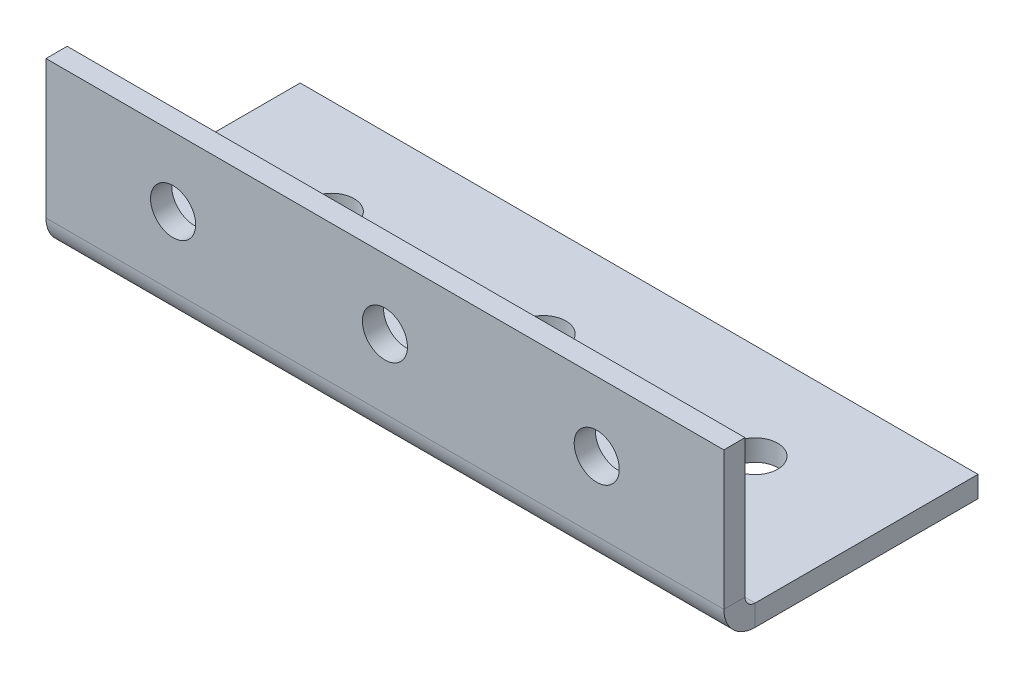
ISO-10303-21;
HEADER;
FILE_DESCRIPTION(('STEP AP214'),'2;1');
FILE_NAME('part.step','',(''),(''),'','','');
FILE_SCHEMA(('AUTOMOTIVE_DESIGN { 1 0 10303 214 1 1 1 1 }'));
ENDSEC;
DATA;
#1=APPLICATION_CONTEXT('core data for automotive mechanical design processes');
#2=APPLICATION_PROTOCOL_DEFINITION('international standard','automotive_design',2000,#1);
#3=PRODUCT_CONTEXT('',#1,'mechanical');
#4=PRODUCT('Part','Part','',(#3));
#5=PRODUCT_RELATED_PRODUCT_CATEGORY('part','',(#4));
#6=PRODUCT_DEFINITION_FORMATION('','',#4);
#7=PRODUCT_DEFINITION_CONTEXT('part definition',#1,'design');
#8=PRODUCT_DEFINITION('design','',#6,#7);
#9=PRODUCT_DEFINITION_SHAPE('','',#8);
#10=(LENGTH_UNIT() NAMED_UNIT(*) SI_UNIT(.MILLI.,.METRE.));
#11=(NAMED_UNIT(*) PLANE_ANGLE_UNIT() SI_UNIT($,.RADIAN.));
#12=(NAMED_UNIT(*) SI_UNIT($,.STERADIAN.) SOLID_ANGLE_UNIT());
#13=UNCERTAINTY_MEASURE_WITH_UNIT(LENGTH_MEASURE(1.E-05),#10,'distance_accuracy_value','');
#14=(GEOMETRIC_REPRESENTATION_CONTEXT(3) GLOBAL_UNCERTAINTY_ASSIGNED_CONTEXT((#13)) GLOBAL_UNIT_ASSIGNED_CONTEXT((#10,
#11,#12)) REPRESENTATION_CONTEXT('',''));
#15=CARTESIAN_POINT('',(0.,0.,0.));
#16=DIRECTION('',(0.,0.,1.));
#17=DIRECTION('',(1.,0.,0.));
#18=AXIS2_PLACEMENT_3D('',#15,#16,#17);
#19=CARTESIAN_POINT('',(0.,0.,0.));
#20=DIRECTION('',(0.,-1.,0.));
#21=DIRECTION('',(0.,0.,-1.));
#22=AXIS2_PLACEMENT_3D('',#19,#20,#21);
#23=PLANE('',#22);
#24=CARTESIAN_POINT('',(19.05,0.,-23.749));
#25=DIRECTION('',(0.,1.,0.));
#26=DIRECTION('',(0.,0.,1.));
#27=AXIS2_PLACEMENT_3D('',#24,#25,#26);
#28=CIRCLE('',#27,3.37819999999999);
#29=CARTESIAN_POINT('',(19.05,0.,-20.3708));
#30=VERTEX_POINT('',#29);
#31=EDGE_CURVE('E211',#30,#30,#28,.T.);
#32=ORIENTED_EDGE('',*,*,#31,.F.);
#33=EDGE_LOOP('',(#32));
#34=FACE_BOUND('',#33,.T.);
#35=CARTESIAN_POINT('',(50.8,0.,-23.749));
#36=DIRECTION('',(0.,1.,0.));
#37=DIRECTION('',(0.,0.,1.));
#38=AXIS2_PLACEMENT_3D('',#35,#36,#37);
#39=CIRCLE('',#38,3.37819999999999);
#40=CARTESIAN_POINT('',(50.8,0.,-20.3708));
#41=VERTEX_POINT('',#40);
#42=EDGE_CURVE('E205',#41,#41,#39,.T.);
#43=ORIENTED_EDGE('',*,*,#42,.F.);
#44=EDGE_LOOP('',(#43));
#45=FACE_BOUND('',#44,.T.);
#46=DIRECTION('',(1.,0.,0.));
#47=VECTOR('',#46,1.);
#48=CARTESIAN_POINT('',(101.6,0.,-4.699));
#49=LINE('',#48,#47);
#50=CARTESIAN_POINT('',(101.6,0.,-4.699));
#51=VERTEX_POINT('',#50);
#52=CARTESIAN_POINT('',(0.,0.,-4.699));
#53=VERTEX_POINT('',#52);
#54=EDGE_CURVE('E130',#51,#53,#49,.F.);
#55=ORIENTED_EDGE('',*,*,#54,.F.);
#56=DIRECTION('',(0.,0.,-1.));
#57=VECTOR('',#56,1.);
#58=CARTESIAN_POINT('',(101.6,0.,0.));
#59=LINE('',#58,#57);
#60=CARTESIAN_POINT('',(101.6,0.,-38.1));
#61=VERTEX_POINT('',#60);
#62=EDGE_CURVE('E110',#51,#61,#59,.T.);
#63=ORIENTED_EDGE('',*,*,#62,.T.);
#64=DIRECTION('',(-1.,0.,0.));
#65=VECTOR('',#64,1.);
#66=CARTESIAN_POINT('',(0.,0.,-38.1));
#67=LINE('',#66,#65);
#68=CARTESIAN_POINT('',(0.,0.,-38.1));
#69=VERTEX_POINT('',#68);
#70=EDGE_CURVE('E100',#61,#69,#67,.T.);
#71=ORIENTED_EDGE('',*,*,#70,.T.);
#72=DIRECTION('',(0.,0.,1.));
#73=VECTOR('',#72,1.);
#74=CARTESIAN_POINT('',(0.,0.,0.));
#75=LINE('',#74,#73);
#76=EDGE_CURVE('E105',#69,#53,#75,.T.);
#77=ORIENTED_EDGE('',*,*,#76,.T.);
#78=EDGE_LOOP('',(#55,#63,#71,#77));
#79=FACE_BOUND('',#78,.T.);
#80=CARTESIAN_POINT('',(82.55,0.,-23.749));
#81=DIRECTION('',(0.,1.,0.));
#82=DIRECTION('',(0.,0.,1.));
#83=AXIS2_PLACEMENT_3D('',#80,#81,#82);
#84=CIRCLE('',#83,3.3782);
#85=CARTESIAN_POINT('',(82.55,0.,-20.3708));
#86=VERTEX_POINT('',#85);
#87=EDGE_CURVE('E199',#86,#86,#84,.T.);
#88=ORIENTED_EDGE('',*,*,#87,.F.);
#89=EDGE_LOOP('',(#88));
#90=FACE_BOUND('',#89,.T.);
#91=ADVANCED_FACE('F62',(#34,#45,#79,#90),#23,.F.);
#92=CARTESIAN_POINT('',(101.6,-3.175,0.));
#93=DIRECTION('',(1.,0.,0.));
#94=DIRECTION('',(0.,0.,-1.));
#95=AXIS2_PLACEMENT_3D('',#92,#93,#94);
#96=PLANE('',#95);
#97=ORIENTED_EDGE('',*,*,#62,.F.);
#98=DIRECTION('',(0.,-1.,0.));
#99=VECTOR('',#98,1.);
#100=CARTESIAN_POINT('',(101.6,0.,-4.699));
#101=LINE('',#100,#99);
#102=CARTESIAN_POINT('',(101.6,-3.17500000000001,-4.699));
#103=VERTEX_POINT('',#102);
#104=EDGE_CURVE('E123',#51,#103,#101,.T.);
#105=ORIENTED_EDGE('',*,*,#104,.T.);
#106=DIRECTION('',(0.,0.,-1.));
#107=VECTOR('',#106,1.);
#108=CARTESIAN_POINT('',(101.6,-3.175,0.));
#109=LINE('',#108,#107);
#110=CARTESIAN_POINT('',(101.6,-3.175,-38.1));
#111=VERTEX_POINT('',#110);
#112=EDGE_CURVE('E117',#103,#111,#109,.T.);
#113=ORIENTED_EDGE('',*,*,#112,.T.);
#114=DIRECTION('',(0.,1.,0.));
#115=VECTOR('',#114,1.);
#116=CARTESIAN_POINT('',(101.6,-3.175,-38.1));
#117=LINE('',#116,#115);
#118=EDGE_CURVE('E66',#111,#61,#117,.T.);
#119=ORIENTED_EDGE('',*,*,#118,.T.);
#120=EDGE_LOOP('',(#97,#105,#113,#119));
#121=FACE_BOUND('',#120,.T.);
#122=ADVANCED_FACE('F220',(#121),#96,.T.);
#123=CARTESIAN_POINT('',(0.,-3.175,0.));
#124=DIRECTION('',(0.,-1.,0.));
#125=DIRECTION('',(0.,0.,-1.));
#126=AXIS2_PLACEMENT_3D('',#123,#124,#125);
#127=PLANE('',#126);
#128=CARTESIAN_POINT('',(19.05,-3.175,-23.749));
#129=DIRECTION('',(0.,-1.,0.));
#130=DIRECTION('',(0.,0.,-1.));
#131=AXIS2_PLACEMENT_3D('',#128,#129,#130);
#132=CIRCLE('',#131,3.3782);
#133=CARTESIAN_POINT('',(19.05,-3.175,-27.1272));
#134=VERTEX_POINT('',#133);
#135=EDGE_CURVE('E208',#134,#134,#132,.T.);
#136=ORIENTED_EDGE('',*,*,#135,.F.);
#137=EDGE_LOOP('',(#136));
#138=FACE_BOUND('',#137,.T.);
#139=CARTESIAN_POINT('',(50.8,-3.175,-23.749));
#140=DIRECTION('',(0.,-1.,0.));
#141=DIRECTION('',(0.,0.,-1.));
#142=AXIS2_PLACEMENT_3D('',#139,#140,#141);
#143=CIRCLE('',#142,3.37819999999999);
#144=CARTESIAN_POINT('',(50.8,-3.175,-27.1272));
#145=VERTEX_POINT('',#144);
#146=EDGE_CURVE('E202',#145,#145,#143,.T.);
#147=ORIENTED_EDGE('',*,*,#146,.F.);
#148=EDGE_LOOP('',(#147));
#149=FACE_BOUND('',#148,.T.);
#150=CARTESIAN_POINT('',(82.55,-3.175,-23.749));
#151=DIRECTION('',(0.,-1.,0.));
#152=DIRECTION('',(0.,0.,-1.));
#153=AXIS2_PLACEMENT_3D('',#150,#151,#152);
#154=CIRCLE('',#153,3.3782);
#155=CARTESIAN_POINT('',(82.55,-3.175,-27.1272));
#156=VERTEX_POINT('',#155);
#157=EDGE_CURVE('E196',#156,#156,#154,.T.);
#158=ORIENTED_EDGE('',*,*,#157,.F.);
#159=EDGE_LOOP('',(#158));
#160=FACE_BOUND('',#159,.T.);
#161=ORIENTED_EDGE('',*,*,#112,.F.);
#162=DIRECTION('',(1.,0.,0.));
#163=VECTOR('',#162,1.);
#164=CARTESIAN_POINT('',(101.6,-3.17500000000001,-4.699));
#165=LINE('',#164,#163);
#166=CARTESIAN_POINT('',(0.,-3.175,-4.699));
#167=VERTEX_POINT('',#166);
#168=EDGE_CURVE('E140',#103,#167,#165,.F.);
#169=ORIENTED_EDGE('',*,*,#168,.T.);
#170=DIRECTION('',(0.,0.,1.));
#171=VECTOR('',#170,1.);
#172=CARTESIAN_POINT('',(0.,-3.175,0.));
#173=LINE('',#172,#171);
#174=CARTESIAN_POINT('',(0.,-3.175,-38.1));
#175=VERTEX_POINT('',#174);
#176=EDGE_CURVE('E115',#175,#167,#173,.T.);
#177=ORIENTED_EDGE('',*,*,#176,.F.);
#178=DIRECTION('',(-1.,0.,0.));
#179=VECTOR('',#178,1.);
#180=CARTESIAN_POINT('',(0.,-3.175,-38.1));
#181=LINE('',#180,#179);
#182=EDGE_CURVE('E102',#111,#175,#181,.T.);
#183=ORIENTED_EDGE('',*,*,#182,.F.);
#184=EDGE_LOOP('',(#161,#169,#177,#183));
#185=FACE_BOUND('',#184,.T.);
#186=ADVANCED_FACE('F231',(#138,#149,#160,#185),#127,.T.);
#187=CARTESIAN_POINT('',(0.,-3.175,0.));
#188=DIRECTION('',(-1.,0.,0.));
#189=DIRECTION('',(0.,0.,1.));
#190=AXIS2_PLACEMENT_3D('',#187,#188,#189);
#191=PLANE('',#190);
#192=DIRECTION('',(0.,-1.,0.));
#193=VECTOR('',#192,1.);
#194=CARTESIAN_POINT('',(0.,0.,-4.699));
#195=LINE('',#194,#193);
#196=EDGE_CURVE('E107',#53,#167,#195,.T.);
#197=ORIENTED_EDGE('',*,*,#196,.F.);
#198=ORIENTED_EDGE('',*,*,#76,.F.);
#199=DIRECTION('',(0.,1.,0.));
#200=VECTOR('',#199,1.);
#201=CARTESIAN_POINT('',(0.,-3.175,-38.1));
#202=LINE('',#201,#200);
#203=EDGE_CURVE('E13',#175,#69,#202,.T.);
#204=ORIENTED_EDGE('',*,*,#203,.F.);
#205=ORIENTED_EDGE('',*,*,#176,.T.);
#206=EDGE_LOOP('',(#197,#198,#204,#205));
#207=FACE_BOUND('',#206,.T.);
#208=ADVANCED_FACE('F64',(#207),#191,.T.);
#209=CARTESIAN_POINT('',(0.,-3.175,-38.1));
#210=DIRECTION('',(0.,0.,-1.));
#211=DIRECTION('',(-1.,0.,0.));
#212=AXIS2_PLACEMENT_3D('',#209,#210,#211);
#213=PLANE('',#212);
#214=ORIENTED_EDGE('',*,*,#70,.F.);
#215=ORIENTED_EDGE('',*,*,#118,.F.);
#216=ORIENTED_EDGE('',*,*,#182,.T.);
#217=ORIENTED_EDGE('',*,*,#203,.T.);
#218=EDGE_LOOP('',(#214,#215,#216,#217));
#219=FACE_BOUND('',#218,.T.);
#220=ADVANCED_FACE('F97',(#219),#213,.T.);
#221=CARTESIAN_POINT('',(0.,1.52399999999999,-4.699));
#222=DIRECTION('',(-1.,0.,0.));
#223=DIRECTION('',(0.,0.,1.));
#224=AXIS2_PLACEMENT_3D('',#221,#222,#223);
#225=PLANE('',#224);
#226=DIRECTION('',(0.,0.,-1.));
#227=VECTOR('',#226,1.);
#228=CARTESIAN_POINT('',(0.,1.52399999999999,0.));
#229=LINE('',#228,#227);
#230=CARTESIAN_POINT('',(0.,1.52399999999999,-3.175));
#231=VERTEX_POINT('',#230);
#232=CARTESIAN_POINT('',(0.,1.52399999999999,0.));
#233=VERTEX_POINT('',#232);
#234=EDGE_CURVE('E144',#231,#233,#229,.F.);
#235=ORIENTED_EDGE('',*,*,#234,.F.);
#236=CARTESIAN_POINT('',(0.,1.52399999999999,-4.699));
#237=DIRECTION('',(1.,0.,0.));
#238=DIRECTION('',(0.,0.,-1.));
#239=AXIS2_PLACEMENT_3D('',#236,#237,#238);
#240=CIRCLE('',#239,1.524);
#241=EDGE_CURVE('E134',#53,#231,#240,.F.);
#242=ORIENTED_EDGE('',*,*,#241,.F.);
#243=ORIENTED_EDGE('',*,*,#196,.T.);
#244=CARTESIAN_POINT('',(0.,1.52399999999999,-4.699));
#245=DIRECTION('',(1.,0.,0.));
#246=DIRECTION('',(0.,0.,-1.));
#247=AXIS2_PLACEMENT_3D('',#244,#245,#246);
#248=CIRCLE('',#247,4.699);
#249=EDGE_CURVE('E77',#167,#233,#248,.F.);
#250=ORIENTED_EDGE('',*,*,#249,.T.);
#251=EDGE_LOOP('',(#235,#242,#243,#250));
#252=FACE_BOUND('',#251,.T.);
#253=ADVANCED_FACE('F287',(#252),#225,.T.);
#254=CARTESIAN_POINT('',(101.6,1.52399999999999,-4.699));
#255=DIRECTION('',(-1.,0.,0.));
#256=DIRECTION('',(0.,0.,1.));
#257=AXIS2_PLACEMENT_3D('',#254,#255,#256);
#258=PLANE('',#257);
#259=CARTESIAN_POINT('',(101.6,1.52399999999999,-4.699));
#260=DIRECTION('',(1.,0.,0.));
#261=DIRECTION('',(0.,0.,-1.));
#262=AXIS2_PLACEMENT_3D('',#259,#260,#261);
#263=CIRCLE('',#262,1.524);
#264=CARTESIAN_POINT('',(101.6,1.52399999999999,-3.175));
#265=VERTEX_POINT('',#264);
#266=EDGE_CURVE('E127',#265,#51,#263,.T.);
#267=ORIENTED_EDGE('',*,*,#266,.F.);
#268=DIRECTION('',(0.,0.,-1.));
#269=VECTOR('',#268,1.);
#270=CARTESIAN_POINT('',(101.6,1.52399999999999,-3.17499999999999));
#271=LINE('',#270,#269);
#272=CARTESIAN_POINT('',(101.6,1.52399999999999,0.));
#273=VERTEX_POINT('',#272);
#274=EDGE_CURVE('E151',#265,#273,#271,.F.);
#275=ORIENTED_EDGE('',*,*,#274,.T.);
#276=CARTESIAN_POINT('',(101.6,1.52399999999999,-4.699));
#277=DIRECTION('',(1.,0.,0.));
#278=DIRECTION('',(0.,0.,-1.));
#279=AXIS2_PLACEMENT_3D('',#276,#277,#278);
#280=CIRCLE('',#279,4.699);
#281=EDGE_CURVE('E137',#273,#103,#280,.T.);
#282=ORIENTED_EDGE('',*,*,#281,.T.);
#283=ORIENTED_EDGE('',*,*,#104,.F.);
#284=EDGE_LOOP('',(#267,#275,#282,#283));
#285=FACE_BOUND('',#284,.T.);
#286=ADVANCED_FACE('F246',(#285),#258,.F.);
#287=CARTESIAN_POINT('',(101.6,1.52399999999999,-4.699));
#288=DIRECTION('',(1.,0.,0.));
#289=DIRECTION('',(0.,0.,1.));
#290=AXIS2_PLACEMENT_3D('',#287,#288,#289);
#291=CYLINDRICAL_SURFACE('',#290,4.699);
#292=ORIENTED_EDGE('',*,*,#168,.F.);
#293=ORIENTED_EDGE('',*,*,#281,.F.);
#294=DIRECTION('',(1.,0.,0.));
#295=VECTOR('',#294,1.);
#296=CARTESIAN_POINT('',(0.,1.52399999999999,0.));
#297=LINE('',#296,#295);
#298=EDGE_CURVE('E154',#273,#233,#297,.F.);
#299=ORIENTED_EDGE('',*,*,#298,.T.);
#300=ORIENTED_EDGE('',*,*,#249,.F.);
#301=EDGE_LOOP('',(#292,#293,#299,#300));
#302=FACE_BOUND('',#301,.T.);
#303=ADVANCED_FACE('F284',(#302),#291,.T.);
#304=CARTESIAN_POINT('',(101.6,1.52399999999999,-4.699));
#305=DIRECTION('',(1.,0.,0.));
#306=DIRECTION('',(0.,0.,1.));
#307=AXIS2_PLACEMENT_3D('',#304,#305,#306);
#308=CYLINDRICAL_SURFACE('',#307,1.524);
#309=ORIENTED_EDGE('',*,*,#54,.T.);
#310=ORIENTED_EDGE('',*,*,#241,.T.);
#311=DIRECTION('',(1.,0.,0.));
#312=VECTOR('',#311,1.);
#313=CARTESIAN_POINT('',(0.,1.52399999999999,-3.175));
#314=LINE('',#313,#312);
#315=EDGE_CURVE('E147',#231,#265,#314,.T.);
#316=ORIENTED_EDGE('',*,*,#315,.T.);
#317=ORIENTED_EDGE('',*,*,#266,.T.);
#318=EDGE_LOOP('',(#309,#310,#316,#317));
#319=FACE_BOUND('',#318,.T.);
#320=ADVANCED_FACE('F252',(#319),#308,.F.);
#321=CARTESIAN_POINT('',(101.6,22.225,0.));
#322=DIRECTION('',(-1.,0.,0.));
#323=DIRECTION('',(0.,0.,1.));
#324=AXIS2_PLACEMENT_3D('',#321,#322,#323);
#325=PLANE('',#324);
#326=ORIENTED_EDGE('',*,*,#274,.F.);
#327=DIRECTION('',(0.,-1.,0.));
#328=VECTOR('',#327,1.);
#329=CARTESIAN_POINT('',(101.6,22.225,-3.175));
#330=LINE('',#329,#328);
#331=CARTESIAN_POINT('',(101.6,22.225,-3.175));
#332=VERTEX_POINT('',#331);
#333=EDGE_CURVE('E156',#265,#332,#330,.F.);
#334=ORIENTED_EDGE('',*,*,#333,.T.);
#335=DIRECTION('',(0.,0.,-1.));
#336=VECTOR('',#335,1.);
#337=CARTESIAN_POINT('',(101.6,22.225,0.));
#338=LINE('',#337,#336);
#339=CARTESIAN_POINT('',(101.6,22.225,0.));
#340=VERTEX_POINT('',#339);
#341=EDGE_CURVE('E131',#340,#332,#338,.T.);
#342=ORIENTED_EDGE('',*,*,#341,.F.);
#343=DIRECTION('',(0.,1.,0.));
#344=VECTOR('',#343,1.);
#345=CARTESIAN_POINT('',(101.6,0.,0.));
#346=LINE('',#345,#344);
#347=EDGE_CURVE('E165',#273,#340,#346,.T.);
#348=ORIENTED_EDGE('',*,*,#347,.F.);
#349=EDGE_LOOP('',(#326,#334,#342,#348));
#350=FACE_BOUND('',#349,.T.);
#351=ADVANCED_FACE('F367',(#350),#325,.F.);
#352=CARTESIAN_POINT('',(0.,0.,0.));
#353=DIRECTION('',(1.,0.,0.));
#354=DIRECTION('',(0.,0.,-1.));
#355=AXIS2_PLACEMENT_3D('',#352,#353,#354);
#356=PLANE('',#355);
#357=ORIENTED_EDGE('',*,*,#234,.T.);
#358=DIRECTION('',(0.,-1.,0.));
#359=VECTOR('',#358,1.);
#360=CARTESIAN_POINT('',(0.,0.,0.));
#361=LINE('',#360,#359);
#362=CARTESIAN_POINT('',(0.,22.225,0.));
#363=VERTEX_POINT('',#362);
#364=EDGE_CURVE('E171',#363,#233,#361,.T.);
#365=ORIENTED_EDGE('',*,*,#364,.F.);
#366=DIRECTION('',(0.,0.,-1.));
#367=VECTOR('',#366,1.);
#368=CARTESIAN_POINT('',(0.,22.225,0.));
#369=LINE('',#368,#367);
#370=CARTESIAN_POINT('',(0.,22.225,-3.175));
#371=VERTEX_POINT('',#370);
#372=EDGE_CURVE('E174',#363,#371,#369,.T.);
#373=ORIENTED_EDGE('',*,*,#372,.T.);
#374=DIRECTION('',(0.,1.,0.));
#375=VECTOR('',#374,1.);
#376=CARTESIAN_POINT('',(0.,0.,-3.175));
#377=LINE('',#376,#375);
#378=EDGE_CURVE('E162',#371,#231,#377,.F.);
#379=ORIENTED_EDGE('',*,*,#378,.T.);
#380=EDGE_LOOP('',(#357,#365,#373,#379));
#381=FACE_BOUND('',#380,.T.);
#382=ADVANCED_FACE('F266',(#381),#356,.F.);
#383=CARTESIAN_POINT('',(0.,0.,0.));
#384=DIRECTION('',(0.,0.,-1.));
#385=DIRECTION('',(-1.,0.,0.));
#386=AXIS2_PLACEMENT_3D('',#383,#384,#385);
#387=PLANE('',#386);
#388=CARTESIAN_POINT('',(19.05,11.8745,0.));
#389=DIRECTION('',(0.,0.,-1.));
#390=DIRECTION('',(-1.,0.,0.));
#391=AXIS2_PLACEMENT_3D('',#388,#389,#390);
#392=CIRCLE('',#391,3.3782);
#393=CARTESIAN_POINT('',(15.6718,11.8745,0.));
#394=VERTEX_POINT('',#393);
#395=EDGE_CURVE('E190',#394,#394,#392,.T.);
#396=ORIENTED_EDGE('',*,*,#395,.T.);
#397=EDGE_LOOP('',(#396));
#398=FACE_BOUND('',#397,.T.);
#399=CARTESIAN_POINT('',(50.8,11.8745,0.));
#400=DIRECTION('',(0.,0.,-1.));
#401=DIRECTION('',(-1.,0.,0.));
#402=AXIS2_PLACEMENT_3D('',#399,#400,#401);
#403=CIRCLE('',#402,3.37819999999999);
#404=CARTESIAN_POINT('',(47.4218,11.8745,0.));
#405=VERTEX_POINT('',#404);
#406=EDGE_CURVE('E184',#405,#405,#403,.T.);
#407=ORIENTED_EDGE('',*,*,#406,.T.);
#408=EDGE_LOOP('',(#407));
#409=FACE_BOUND('',#408,.T.);
#410=CARTESIAN_POINT('',(82.55,11.8745,0.));
#411=DIRECTION('',(0.,0.,-1.));
#412=DIRECTION('',(-1.,0.,0.));
#413=AXIS2_PLACEMENT_3D('',#410,#411,#412);
#414=CIRCLE('',#413,3.3782);
#415=CARTESIAN_POINT('',(79.1718,11.8745,0.));
#416=VERTEX_POINT('',#415);
#417=EDGE_CURVE('E148',#416,#416,#414,.T.);
#418=ORIENTED_EDGE('',*,*,#417,.T.);
#419=EDGE_LOOP('',(#418));
#420=FACE_BOUND('',#419,.T.);
#421=ORIENTED_EDGE('',*,*,#298,.F.);
#422=ORIENTED_EDGE('',*,*,#347,.T.);
#423=DIRECTION('',(-1.,0.,0.));
#424=VECTOR('',#423,1.);
#425=CARTESIAN_POINT('',(0.,22.225,0.));
#426=LINE('',#425,#424);
#427=EDGE_CURVE('E168',#340,#363,#426,.T.);
#428=ORIENTED_EDGE('',*,*,#427,.T.);
#429=ORIENTED_EDGE('',*,*,#364,.T.);
#430=EDGE_LOOP('',(#421,#422,#428,#429));
#431=FACE_BOUND('',#430,.T.);
#432=ADVANCED_FACE('F388',(#398,#409,#420,#431),#387,.F.);
#433=CARTESIAN_POINT('',(0.,0.,-3.175));
#434=DIRECTION('',(0.,0.,-1.));
#435=DIRECTION('',(-1.,0.,0.));
#436=AXIS2_PLACEMENT_3D('',#433,#434,#435);
#437=PLANE('',#436);
#438=CARTESIAN_POINT('',(19.05,11.8745,-3.175));
#439=DIRECTION('',(0.,0.,-1.));
#440=DIRECTION('',(-1.,0.,0.));
#441=AXIS2_PLACEMENT_3D('',#438,#439,#440);
#442=CIRCLE('',#441,3.37819999999999);
#443=CARTESIAN_POINT('',(15.6718,11.8745,-3.175));
#444=VERTEX_POINT('',#443);
#445=EDGE_CURVE('E193',#444,#444,#442,.T.);
#446=ORIENTED_EDGE('',*,*,#445,.F.);
#447=EDGE_LOOP('',(#446));
#448=FACE_BOUND('',#447,.T.);
#449=CARTESIAN_POINT('',(50.8,11.8745,-3.175));
#450=DIRECTION('',(0.,0.,-1.));
#451=DIRECTION('',(-1.,0.,0.));
#452=AXIS2_PLACEMENT_3D('',#449,#450,#451);
#453=CIRCLE('',#452,3.37819999999999);
#454=CARTESIAN_POINT('',(47.4218,11.8745,-3.175));
#455=VERTEX_POINT('',#454);
#456=EDGE_CURVE('E187',#455,#455,#453,.T.);
#457=ORIENTED_EDGE('',*,*,#456,.F.);
#458=EDGE_LOOP('',(#457));
#459=FACE_BOUND('',#458,.T.);
#460=CARTESIAN_POINT('',(82.55,11.8745,-3.175));
#461=DIRECTION('',(0.,0.,-1.));
#462=DIRECTION('',(-1.,0.,0.));
#463=AXIS2_PLACEMENT_3D('',#460,#461,#462);
#464=CIRCLE('',#463,3.3782);
#465=CARTESIAN_POINT('',(79.1718,11.8745,-3.175));
#466=VERTEX_POINT('',#465);
#467=EDGE_CURVE('E181',#466,#466,#464,.T.);
#468=ORIENTED_EDGE('',*,*,#467,.F.);
#469=EDGE_LOOP('',(#468));
#470=FACE_BOUND('',#469,.T.);
#471=ORIENTED_EDGE('',*,*,#333,.F.);
#472=ORIENTED_EDGE('',*,*,#315,.F.);
#473=ORIENTED_EDGE('',*,*,#378,.F.);
#474=DIRECTION('',(1.,0.,0.));
#475=VECTOR('',#474,1.);
#476=CARTESIAN_POINT('',(0.,22.225,-3.175));
#477=LINE('',#476,#475);
#478=EDGE_CURVE('E159',#332,#371,#477,.F.);
#479=ORIENTED_EDGE('',*,*,#478,.F.);
#480=EDGE_LOOP('',(#471,#472,#473,#479));
#481=FACE_BOUND('',#480,.T.);
#482=ADVANCED_FACE('F259',(#448,#459,#470,#481),#437,.T.);
#483=CARTESIAN_POINT('',(0.,22.225,0.));
#484=DIRECTION('',(0.,-1.,0.));
#485=DIRECTION('',(0.,0.,-1.));
#486=AXIS2_PLACEMENT_3D('',#483,#484,#485);
#487=PLANE('',#486);
#488=ORIENTED_EDGE('',*,*,#478,.T.);
#489=ORIENTED_EDGE('',*,*,#372,.F.);
#490=ORIENTED_EDGE('',*,*,#427,.F.);
#491=ORIENTED_EDGE('',*,*,#341,.T.);
#492=EDGE_LOOP('',(#488,#489,#490,#491));
#493=FACE_BOUND('',#492,.T.);
#494=ADVANCED_FACE('F274',(#493),#487,.F.);
#495=CARTESIAN_POINT('',(82.55,11.8745,-3.175));
#496=DIRECTION('',(0.,0.,-1.));
#497=DIRECTION('',(-1.,0.,0.));
#498=AXIS2_PLACEMENT_3D('',#495,#496,#497);
#499=CYLINDRICAL_SURFACE('',#498,3.3782);
#500=ORIENTED_EDGE('',*,*,#417,.F.);
#501=EDGE_LOOP('',(#500));
#502=FACE_BOUND('',#501,.T.);
#503=ORIENTED_EDGE('',*,*,#467,.T.);
#504=EDGE_LOOP('',(#503));
#505=FACE_BOUND('',#504,.T.);
#506=ADVANCED_FACE('F420',(#502,#505),#499,.F.);
#507=CARTESIAN_POINT('',(50.8,11.8745,-3.175));
#508=DIRECTION('',(0.,0.,-1.));
#509=DIRECTION('',(-1.,0.,0.));
#510=AXIS2_PLACEMENT_3D('',#507,#508,#509);
#511=CYLINDRICAL_SURFACE('',#510,3.37819999999999);
#512=ORIENTED_EDGE('',*,*,#406,.F.);
#513=EDGE_LOOP('',(#512));
#514=FACE_BOUND('',#513,.T.);
#515=ORIENTED_EDGE('',*,*,#456,.T.);
#516=EDGE_LOOP('',(#515));
#517=FACE_BOUND('',#516,.T.);
#518=ADVANCED_FACE('F438',(#514,#517),#511,.F.);
#519=CARTESIAN_POINT('',(19.05,11.8745,-3.175));
#520=DIRECTION('',(0.,0.,-1.));
#521=DIRECTION('',(-1.,0.,0.));
#522=AXIS2_PLACEMENT_3D('',#519,#520,#521);
#523=CYLINDRICAL_SURFACE('',#522,3.3782);
#524=ORIENTED_EDGE('',*,*,#395,.F.);
#525=EDGE_LOOP('',(#524));
#526=FACE_BOUND('',#525,.T.);
#527=ORIENTED_EDGE('',*,*,#445,.T.);
#528=EDGE_LOOP('',(#527));
#529=FACE_BOUND('',#528,.T.);
#530=ADVANCED_FACE('F449',(#526,#529),#523,.F.);
#531=CARTESIAN_POINT('',(82.55,0.,-23.749));
#532=DIRECTION('',(0.,1.,0.));
#533=DIRECTION('',(0.,0.,1.));
#534=AXIS2_PLACEMENT_3D('',#531,#532,#533);
#535=CYLINDRICAL_SURFACE('',#534,3.3782);
#536=ORIENTED_EDGE('',*,*,#87,.T.);
#537=EDGE_LOOP('',(#536));
#538=FACE_BOUND('',#537,.T.);
#539=ORIENTED_EDGE('',*,*,#157,.T.);
#540=EDGE_LOOP('',(#539));
#541=FACE_BOUND('',#540,.T.);
#542=ADVANCED_FACE('F227',(#538,#541),#535,.F.);
#543=CARTESIAN_POINT('',(50.8,0.,-23.749));
#544=DIRECTION('',(0.,1.,0.));
#545=DIRECTION('',(0.,0.,1.));
#546=AXIS2_PLACEMENT_3D('',#543,#544,#545);
#547=CYLINDRICAL_SURFACE('',#546,3.37819999999999);
#548=ORIENTED_EDGE('',*,*,#42,.T.);
#549=EDGE_LOOP('',(#548));
#550=FACE_BOUND('',#549,.T.);
#551=ORIENTED_EDGE('',*,*,#146,.T.);
#552=EDGE_LOOP('',(#551));
#553=FACE_BOUND('',#552,.T.);
#554=ADVANCED_FACE('F224',(#550,#553),#547,.F.);
#555=CARTESIAN_POINT('',(19.05,0.,-23.749));
#556=DIRECTION('',(0.,1.,0.));
#557=DIRECTION('',(0.,0.,1.));
#558=AXIS2_PLACEMENT_3D('',#555,#556,#557);
#559=CYLINDRICAL_SURFACE('',#558,3.3782);
#560=ORIENTED_EDGE('',*,*,#31,.T.);
#561=EDGE_LOOP('',(#560));
#562=FACE_BOUND('',#561,.T.);
#563=ORIENTED_EDGE('',*,*,#135,.T.);
#564=EDGE_LOOP('',(#563));
#565=FACE_BOUND('',#564,.T.);
#566=ADVANCED_FACE('F215',(#562,#565),#559,.F.);
#567=CLOSED_SHELL('',(#91,#122,#186,#208,#220,#253,#286,#303,#320,#351,#382,#432,#482,#494,#506,
#518,#530,#542,#554,#566));
#568=MANIFOLD_SOLID_BREP('B2',#567);
#569=ADVANCED_BREP_SHAPE_REPRESENTATION('',(#18,#568),#14);
#570=SHAPE_DEFINITION_REPRESENTATION(#9,#569);
ENDSEC;
END-ISO-10303-21;
